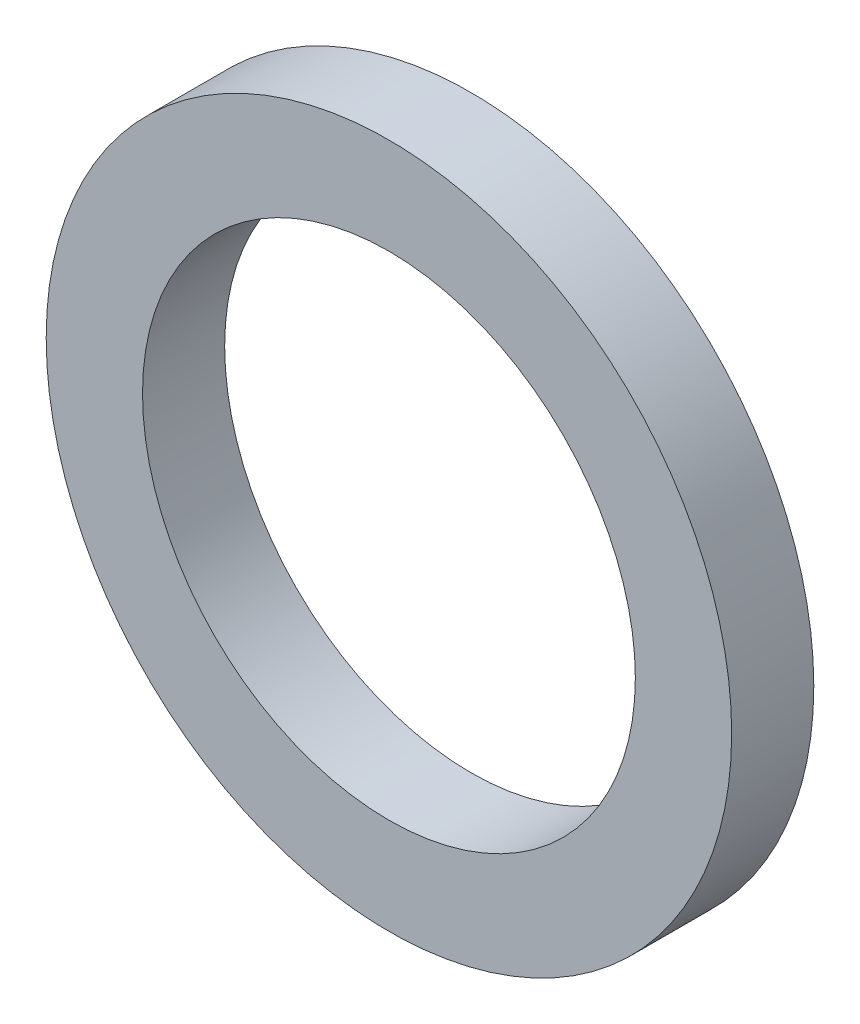
ISO-10303-21;
HEADER;
FILE_DESCRIPTION(('STEP AP214'),'2;1');
FILE_NAME('part.step','',(''),(''),'','','');
FILE_SCHEMA(('AUTOMOTIVE_DESIGN { 1 0 10303 214 1 1 1 1 }'));
ENDSEC;
DATA;
#1=APPLICATION_CONTEXT('core data for automotive mechanical design processes');
#2=APPLICATION_PROTOCOL_DEFINITION('international standard','automotive_design',2000,#1);
#3=PRODUCT_CONTEXT('',#1,'mechanical');
#4=PRODUCT('Part','Part','',(#3));
#5=PRODUCT_RELATED_PRODUCT_CATEGORY('part','',(#4));
#6=PRODUCT_DEFINITION_FORMATION('','',#4);
#7=PRODUCT_DEFINITION_CONTEXT('part definition',#1,'design');
#8=PRODUCT_DEFINITION('design','',#6,#7);
#9=PRODUCT_DEFINITION_SHAPE('','',#8);
#10=(LENGTH_UNIT() NAMED_UNIT(*) SI_UNIT(.MILLI.,.METRE.));
#11=(NAMED_UNIT(*) PLANE_ANGLE_UNIT() SI_UNIT($,.RADIAN.));
#12=(NAMED_UNIT(*) SI_UNIT($,.STERADIAN.) SOLID_ANGLE_UNIT());
#13=UNCERTAINTY_MEASURE_WITH_UNIT(LENGTH_MEASURE(1.E-05),#10,'distance_accuracy_value','');
#14=(GEOMETRIC_REPRESENTATION_CONTEXT(3) GLOBAL_UNCERTAINTY_ASSIGNED_CONTEXT((#13)) GLOBAL_UNIT_ASSIGNED_CONTEXT((#10,
#11,#12)) REPRESENTATION_CONTEXT('',''));
#15=CARTESIAN_POINT('',(0.,0.,0.));
#16=DIRECTION('',(0.,0.,1.));
#17=DIRECTION('',(1.,0.,0.));
#18=AXIS2_PLACEMENT_3D('',#15,#16,#17);
#19=CARTESIAN_POINT('',(0.,0.,0.79375));
#20=DIRECTION('',(0.,0.,1.));
#21=DIRECTION('',(1.,0.,0.));
#22=AXIS2_PLACEMENT_3D('',#19,#20,#21);
#23=PLANE('',#22);
#24=CARTESIAN_POINT('',(0.,0.,0.79375));
#25=DIRECTION('',(0.,0.,1.));
#26=DIRECTION('',(1.,0.,0.));
#27=AXIS2_PLACEMENT_3D('',#24,#25,#26);
#28=CIRCLE('',#27,6.62432);
#29=CARTESIAN_POINT('',(6.62432,0.,0.79375));
#30=VERTEX_POINT('',#29);
#31=EDGE_CURVE('E10',#30,#30,#28,.T.);
#32=ORIENTED_EDGE('',*,*,#31,.T.);
#33=EDGE_LOOP('',(#32));
#34=FACE_BOUND('',#33,.T.);
#35=CARTESIAN_POINT('',(0.,0.,0.79375));
#36=DIRECTION('',(0.,0.,1.));
#37=DIRECTION('',(1.,0.,0.));
#38=AXIS2_PLACEMENT_3D('',#35,#36,#37);
#39=CIRCLE('',#38,4.7625);
#40=CARTESIAN_POINT('',(4.7625,0.,0.79375));
#41=VERTEX_POINT('',#40);
#42=EDGE_CURVE('E46',#41,#41,#39,.T.);
#43=ORIENTED_EDGE('',*,*,#42,.F.);
#44=EDGE_LOOP('',(#43));
#45=FACE_BOUND('',#44,.T.);
#46=ADVANCED_FACE('F35',(#34,#45),#23,.T.);
#47=CARTESIAN_POINT('',(0.,0.,-0.79375));
#48=DIRECTION('',(0.,0.,1.));
#49=DIRECTION('',(1.,0.,0.));
#50=AXIS2_PLACEMENT_3D('',#47,#48,#49);
#51=PLANE('',#50);
#52=CARTESIAN_POINT('',(0.,0.,-0.79375));
#53=DIRECTION('',(0.,0.,1.));
#54=DIRECTION('',(1.,0.,0.));
#55=AXIS2_PLACEMENT_3D('',#52,#53,#54);
#56=CIRCLE('',#55,6.62432);
#57=CARTESIAN_POINT('',(6.62432,0.,-0.79375));
#58=VERTEX_POINT('',#57);
#59=EDGE_CURVE('E39',#58,#58,#56,.T.);
#60=ORIENTED_EDGE('',*,*,#59,.F.);
#61=EDGE_LOOP('',(#60));
#62=FACE_BOUND('',#61,.T.);
#63=CARTESIAN_POINT('',(0.,0.,-0.79375));
#64=DIRECTION('',(0.,0.,1.));
#65=DIRECTION('',(1.,0.,0.));
#66=AXIS2_PLACEMENT_3D('',#63,#64,#65);
#67=CIRCLE('',#66,4.7625);
#68=CARTESIAN_POINT('',(4.7625,0.,-0.79375));
#69=VERTEX_POINT('',#68);
#70=EDGE_CURVE('E48',#69,#69,#67,.T.);
#71=ORIENTED_EDGE('',*,*,#70,.T.);
#72=EDGE_LOOP('',(#71));
#73=FACE_BOUND('',#72,.T.);
#74=ADVANCED_FACE('F58',(#62,#73),#51,.F.);
#75=CARTESIAN_POINT('',(0.,0.,0.79375));
#76=DIRECTION('',(0.,0.,-1.));
#77=DIRECTION('',(-1.,0.,0.));
#78=AXIS2_PLACEMENT_3D('',#75,#76,#77);
#79=CYLINDRICAL_SURFACE('',#78,6.62432);
#80=ORIENTED_EDGE('',*,*,#31,.F.);
#81=EDGE_LOOP('',(#80));
#82=FACE_BOUND('',#81,.T.);
#83=ORIENTED_EDGE('',*,*,#59,.T.);
#84=EDGE_LOOP('',(#83));
#85=FACE_BOUND('',#84,.T.);
#86=ADVANCED_FACE('F37',(#82,#85),#79,.T.);
#87=CARTESIAN_POINT('',(0.,0.,0.79375));
#88=DIRECTION('',(0.,0.,-1.));
#89=DIRECTION('',(-1.,0.,0.));
#90=AXIS2_PLACEMENT_3D('',#87,#88,#89);
#91=CYLINDRICAL_SURFACE('',#90,4.7625);
#92=ORIENTED_EDGE('',*,*,#42,.T.);
#93=EDGE_LOOP('',(#92));
#94=FACE_BOUND('',#93,.T.);
#95=ORIENTED_EDGE('',*,*,#70,.F.);
#96=EDGE_LOOP('',(#95));
#97=FACE_BOUND('',#96,.T.);
#98=ADVANCED_FACE('F54',(#94,#97),#91,.F.);
#99=CLOSED_SHELL('',(#46,#74,#86,#98));
#100=MANIFOLD_SOLID_BREP('B2',#99);
#101=ADVANCED_BREP_SHAPE_REPRESENTATION('',(#18,#100),#14);
#102=SHAPE_DEFINITION_REPRESENTATION(#9,#101);
ENDSEC;
END-ISO-10303-21;
